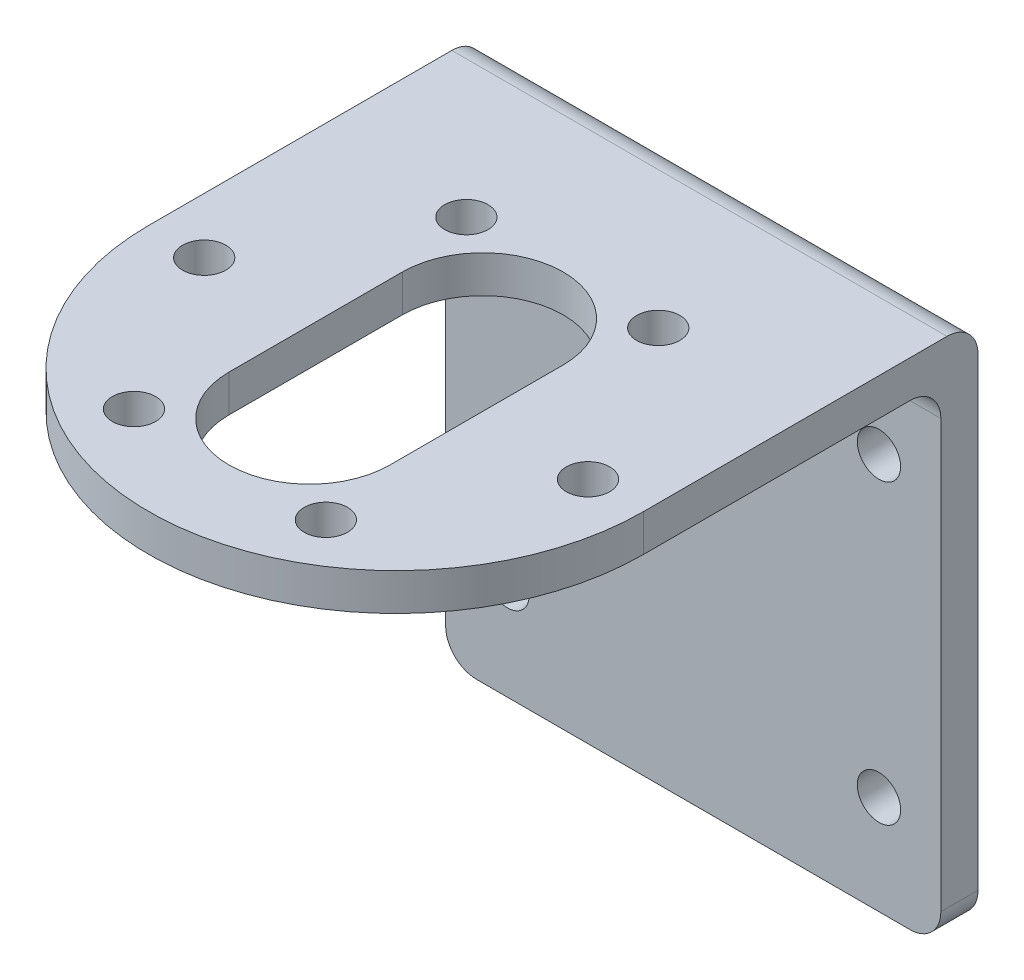
ISO-10303-21;
HEADER;
FILE_DESCRIPTION(('STEP AP214'),'2;1');
FILE_NAME('part.step','',(''),(''),'','','');
FILE_SCHEMA(('AUTOMOTIVE_DESIGN { 1 0 10303 214 1 1 1 1 }'));
ENDSEC;
DATA;
#1=APPLICATION_CONTEXT('core data for automotive mechanical design processes');
#2=APPLICATION_PROTOCOL_DEFINITION('international standard','automotive_design',2000,#1);
#3=PRODUCT_CONTEXT('',#1,'mechanical');
#4=PRODUCT('Part','Part','',(#3));
#5=PRODUCT_RELATED_PRODUCT_CATEGORY('part','',(#4));
#6=PRODUCT_DEFINITION_FORMATION('','',#4);
#7=PRODUCT_DEFINITION_CONTEXT('part definition',#1,'design');
#8=PRODUCT_DEFINITION('design','',#6,#7);
#9=PRODUCT_DEFINITION_SHAPE('','',#8);
#10=(LENGTH_UNIT() NAMED_UNIT(*) SI_UNIT(.MILLI.,.METRE.));
#11=(NAMED_UNIT(*) PLANE_ANGLE_UNIT() SI_UNIT($,.RADIAN.));
#12=(NAMED_UNIT(*) SI_UNIT($,.STERADIAN.) SOLID_ANGLE_UNIT());
#13=UNCERTAINTY_MEASURE_WITH_UNIT(LENGTH_MEASURE(1.E-05),#10,'distance_accuracy_value','');
#14=(GEOMETRIC_REPRESENTATION_CONTEXT(3) GLOBAL_UNCERTAINTY_ASSIGNED_CONTEXT((#13)) GLOBAL_UNIT_ASSIGNED_CONTEXT((#10,
#11,#12)) REPRESENTATION_CONTEXT('',''));
#15=CARTESIAN_POINT('',(0.,0.,0.));
#16=DIRECTION('',(0.,0.,1.));
#17=DIRECTION('',(1.,0.,0.));
#18=AXIS2_PLACEMENT_3D('',#15,#16,#17);
#19=CARTESIAN_POINT('',(20.,19.75,0.));
#20=DIRECTION('',(0.,0.,1.));
#21=DIRECTION('',(1.,0.,0.));
#22=AXIS2_PLACEMENT_3D('',#19,#20,#21);
#23=PLANE('',#22);
#24=CARTESIAN_POINT('',(35.,8.,0.));
#25=DIRECTION('',(0.,0.,-1.));
#26=DIRECTION('',(1.,0.,0.));
#27=AXIS2_PLACEMENT_3D('',#24,#25,#26);
#28=CIRCLE('',#27,1.75);
#29=CARTESIAN_POINT('',(33.25,8.,0.));
#30=VERTEX_POINT('',#29);
#31=EDGE_CURVE('E67',#30,#30,#28,.T.);
#32=ORIENTED_EDGE('',*,*,#31,.F.);
#33=EDGE_LOOP('',(#32));
#34=FACE_BOUND('',#33,.T.);
#35=CARTESIAN_POINT('',(35.,32.,0.));
#36=DIRECTION('',(0.,0.,-1.));
#37=DIRECTION('',(1.,0.,0.));
#38=AXIS2_PLACEMENT_3D('',#35,#36,#37);
#39=CIRCLE('',#38,1.75);
#40=CARTESIAN_POINT('',(33.25,32.,0.));
#41=VERTEX_POINT('',#40);
#42=EDGE_CURVE('E82',#41,#41,#39,.T.);
#43=ORIENTED_EDGE('',*,*,#42,.F.);
#44=EDGE_LOOP('',(#43));
#45=FACE_BOUND('',#44,.T.);
#46=CARTESIAN_POINT('',(5.,8.,0.));
#47=DIRECTION('',(0.,0.,-1.));
#48=DIRECTION('',(1.,0.,0.));
#49=AXIS2_PLACEMENT_3D('',#46,#47,#48);
#50=CIRCLE('',#49,1.75);
#51=CARTESIAN_POINT('',(3.25,8.,0.));
#52=VERTEX_POINT('',#51);
#53=EDGE_CURVE('E50',#52,#52,#50,.T.);
#54=ORIENTED_EDGE('',*,*,#53,.F.);
#55=EDGE_LOOP('',(#54));
#56=FACE_BOUND('',#55,.T.);
#57=CARTESIAN_POINT('',(5.,32.,0.));
#58=DIRECTION('',(0.,0.,-1.));
#59=DIRECTION('',(1.,0.,0.));
#60=AXIS2_PLACEMENT_3D('',#57,#58,#59);
#61=CIRCLE('',#60,1.75);
#62=CARTESIAN_POINT('',(3.25,32.,0.));
#63=VERTEX_POINT('',#62);
#64=EDGE_CURVE('E26',#63,#63,#61,.T.);
#65=ORIENTED_EDGE('',*,*,#64,.F.);
#66=EDGE_LOOP('',(#65));
#67=FACE_BOUND('',#66,.T.);
#68=CARTESIAN_POINT('',(37.5,2.5,0.));
#69=DIRECTION('',(0.,0.,1.));
#70=DIRECTION('',(0.707106781186548,-0.707106781186548,0.));
#71=AXIS2_PLACEMENT_3D('',#68,#69,#70);
#72=CIRCLE('',#71,2.5);
#73=CARTESIAN_POINT('',(37.5,0.,0.));
#74=VERTEX_POINT('',#73);
#75=CARTESIAN_POINT('',(40.,2.5,0.));
#76=VERTEX_POINT('',#75);
#77=EDGE_CURVE('E186',#74,#76,#72,.T.);
#78=ORIENTED_EDGE('',*,*,#77,.F.);
#79=DIRECTION('',(1.,0.,0.));
#80=VECTOR('',#79,1.);
#81=CARTESIAN_POINT('',(0.,0.,0.));
#82=LINE('',#81,#80);
#83=CARTESIAN_POINT('',(2.5,0.,0.));
#84=VERTEX_POINT('',#83);
#85=EDGE_CURVE('E211',#84,#74,#82,.T.);
#86=ORIENTED_EDGE('',*,*,#85,.F.);
#87=CARTESIAN_POINT('',(2.5,2.5,0.));
#88=DIRECTION('',(0.,0.,1.));
#89=DIRECTION('',(-0.707106781186548,-0.707106781186548,0.));
#90=AXIS2_PLACEMENT_3D('',#87,#88,#89);
#91=CIRCLE('',#90,2.5);
#92=CARTESIAN_POINT('',(0.,2.5,0.));
#93=VERTEX_POINT('',#92);
#94=EDGE_CURVE('E247',#93,#84,#91,.T.);
#95=ORIENTED_EDGE('',*,*,#94,.F.);
#96=DIRECTION('',(0.,-1.,0.));
#97=VECTOR('',#96,1.);
#98=CARTESIAN_POINT('',(0.,42.5,0.));
#99=LINE('',#98,#97);
#100=CARTESIAN_POINT('',(0.,40.,0.));
#101=VERTEX_POINT('',#100);
#102=EDGE_CURVE('E256',#101,#93,#99,.T.);
#103=ORIENTED_EDGE('',*,*,#102,.F.);
#104=DIRECTION('',(-1.,0.,0.));
#105=VECTOR('',#104,1.);
#106=CARTESIAN_POINT('',(30.,40.,0.));
#107=LINE('',#106,#105);
#108=CARTESIAN_POINT('',(40.,40.,0.));
#109=VERTEX_POINT('',#108);
#110=EDGE_CURVE('E215',#109,#101,#107,.T.);
#111=ORIENTED_EDGE('',*,*,#110,.F.);
#112=DIRECTION('',(0.,1.,0.));
#113=VECTOR('',#112,1.);
#114=CARTESIAN_POINT('',(40.,0.,0.));
#115=LINE('',#114,#113);
#116=EDGE_CURVE('E11',#76,#109,#115,.T.);
#117=ORIENTED_EDGE('',*,*,#116,.F.);
#118=EDGE_LOOP('',(#78,#86,#95,#103,#111,#117));
#119=FACE_BOUND('',#118,.T.);
#120=ADVANCED_FACE('F17',(#34,#45,#56,#67,#119),#23,.F.);
#121=CARTESIAN_POINT('',(40.,0.,0.));
#122=DIRECTION('',(1.,0.,0.));
#123=DIRECTION('',(0.,1.,0.));
#124=AXIS2_PLACEMENT_3D('',#121,#122,#123);
#125=PLANE('',#124);
#126=DIRECTION('',(0.,0.,1.));
#127=VECTOR('',#126,1.);
#128=CARTESIAN_POINT('',(40.,2.5,0.));
#129=LINE('',#128,#127);
#130=CARTESIAN_POINT('',(40.,2.5,3.));
#131=VERTEX_POINT('',#130);
#132=EDGE_CURVE('E190',#76,#131,#129,.T.);
#133=ORIENTED_EDGE('',*,*,#132,.F.);
#134=ORIENTED_EDGE('',*,*,#116,.T.);
#135=CARTESIAN_POINT('',(40.,40.,2.5));
#136=DIRECTION('',(-1.,0.,0.));
#137=DIRECTION('',(0.,0.707106781186548,-0.707106781186548));
#138=AXIS2_PLACEMENT_3D('',#135,#136,#137);
#139=CIRCLE('',#138,2.5);
#140=CARTESIAN_POINT('',(40.,42.5,2.5));
#141=VERTEX_POINT('',#140);
#142=EDGE_CURVE('E264',#141,#109,#139,.T.);
#143=ORIENTED_EDGE('',*,*,#142,.F.);
#144=DIRECTION('',(0.,0.,1.));
#145=VECTOR('',#144,1.);
#146=CARTESIAN_POINT('',(40.,42.5,0.));
#147=LINE('',#146,#145);
#148=CARTESIAN_POINT('',(40.,42.5,27.));
#149=VERTEX_POINT('',#148);
#150=EDGE_CURVE('E184',#141,#149,#147,.T.);
#151=ORIENTED_EDGE('',*,*,#150,.T.);
#152=DIRECTION('',(0.,-1.,0.));
#153=VECTOR('',#152,1.);
#154=CARTESIAN_POINT('',(40.,39.5,27.));
#155=LINE('',#154,#153);
#156=CARTESIAN_POINT('',(40.,39.5,27.));
#157=VERTEX_POINT('',#156);
#158=EDGE_CURVE('E102',#149,#157,#155,.T.);
#159=ORIENTED_EDGE('',*,*,#158,.T.);
#160=DIRECTION('',(0.,0.,1.));
#161=VECTOR('',#160,1.);
#162=CARTESIAN_POINT('',(40.,39.5,0.));
#163=LINE('',#162,#161);
#164=CARTESIAN_POINT('',(40.,39.5,5.5));
#165=VERTEX_POINT('',#164);
#166=EDGE_CURVE('E451',#165,#157,#163,.T.);
#167=ORIENTED_EDGE('',*,*,#166,.F.);
#168=CARTESIAN_POINT('',(40.,37.,5.5));
#169=DIRECTION('',(1.,0.,0.));
#170=DIRECTION('',(0.,0.707106781186548,-0.707106781186548));
#171=AXIS2_PLACEMENT_3D('',#168,#169,#170);
#172=CIRCLE('',#171,2.5);
#173=CARTESIAN_POINT('',(40.,37.,3.));
#174=VERTEX_POINT('',#173);
#175=EDGE_CURVE('E839',#174,#165,#172,.T.);
#176=ORIENTED_EDGE('',*,*,#175,.F.);
#177=DIRECTION('',(0.,1.,0.));
#178=VECTOR('',#177,1.);
#179=CARTESIAN_POINT('',(40.,0.,3.));
#180=LINE('',#179,#178);
#181=EDGE_CURVE('E224',#131,#174,#180,.T.);
#182=ORIENTED_EDGE('',*,*,#181,.F.);
#183=EDGE_LOOP('',(#133,#134,#143,#151,#159,#167,#176,#182));
#184=FACE_BOUND('',#183,.T.);
#185=ADVANCED_FACE('F613',(#184),#125,.T.);
#186=CARTESIAN_POINT('',(5.,32.,0.));
#187=DIRECTION('',(0.,0.,1.));
#188=DIRECTION('',(1.,0.,0.));
#189=AXIS2_PLACEMENT_3D('',#186,#187,#188);
#190=CYLINDRICAL_SURFACE('',#189,1.75);
#191=CARTESIAN_POINT('',(5.,32.,3.));
#192=DIRECTION('',(0.,0.,-1.));
#193=DIRECTION('',(1.,0.,0.));
#194=AXIS2_PLACEMENT_3D('',#191,#192,#193);
#195=CIRCLE('',#194,1.75);
#196=CARTESIAN_POINT('',(3.25,32.,3.));
#197=VERTEX_POINT('',#196);
#198=EDGE_CURVE('E228',#197,#197,#195,.T.);
#199=ORIENTED_EDGE('',*,*,#198,.F.);
#200=DIRECTION('',(0.,0.,-1.));
#201=VECTOR('',#200,1.);
#202=CARTESIAN_POINT('',(3.25,32.,0.));
#203=LINE('',#202,#201);
#204=EDGE_CURVE('E20',#197,#63,#203,.T.);
#205=ORIENTED_EDGE('',*,*,#204,.T.);
#206=ORIENTED_EDGE('',*,*,#64,.T.);
#207=ORIENTED_EDGE('',*,*,#204,.F.);
#208=EDGE_LOOP('',(#199,#205,#206,#207));
#209=FACE_BOUND('',#208,.T.);
#210=ADVANCED_FACE('F618',(#209),#190,.F.);
#211=CARTESIAN_POINT('',(5.,8.,0.));
#212=DIRECTION('',(0.,0.,1.));
#213=DIRECTION('',(1.,0.,0.));
#214=AXIS2_PLACEMENT_3D('',#211,#212,#213);
#215=CYLINDRICAL_SURFACE('',#214,1.75);
#216=CARTESIAN_POINT('',(5.,8.,3.));
#217=DIRECTION('',(0.,0.,-1.));
#218=DIRECTION('',(1.,0.,0.));
#219=AXIS2_PLACEMENT_3D('',#216,#217,#218);
#220=CIRCLE('',#219,1.75);
#221=CARTESIAN_POINT('',(3.25,8.,3.));
#222=VERTEX_POINT('',#221);
#223=EDGE_CURVE('E232',#222,#222,#220,.T.);
#224=ORIENTED_EDGE('',*,*,#223,.F.);
#225=DIRECTION('',(0.,0.,-1.));
#226=VECTOR('',#225,1.);
#227=CARTESIAN_POINT('',(3.25,8.,0.));
#228=LINE('',#227,#226);
#229=EDGE_CURVE('E119',#222,#52,#228,.T.);
#230=ORIENTED_EDGE('',*,*,#229,.T.);
#231=ORIENTED_EDGE('',*,*,#53,.T.);
#232=ORIENTED_EDGE('',*,*,#229,.F.);
#233=EDGE_LOOP('',(#224,#230,#231,#232));
#234=FACE_BOUND('',#233,.T.);
#235=ADVANCED_FACE('F623',(#234),#215,.F.);
#236=CARTESIAN_POINT('',(35.,32.,0.));
#237=DIRECTION('',(0.,0.,1.));
#238=DIRECTION('',(1.,0.,0.));
#239=AXIS2_PLACEMENT_3D('',#236,#237,#238);
#240=CYLINDRICAL_SURFACE('',#239,1.75);
#241=CARTESIAN_POINT('',(35.,32.,3.));
#242=DIRECTION('',(0.,0.,-1.));
#243=DIRECTION('',(1.,0.,0.));
#244=AXIS2_PLACEMENT_3D('',#241,#242,#243);
#245=CIRCLE('',#244,1.75);
#246=CARTESIAN_POINT('',(33.25,32.,3.));
#247=VERTEX_POINT('',#246);
#248=EDGE_CURVE('E175',#247,#247,#245,.T.);
#249=ORIENTED_EDGE('',*,*,#248,.F.);
#250=DIRECTION('',(0.,0.,-1.));
#251=VECTOR('',#250,1.);
#252=CARTESIAN_POINT('',(33.25,32.,0.));
#253=LINE('',#252,#251);
#254=EDGE_CURVE('E75',#247,#41,#253,.T.);
#255=ORIENTED_EDGE('',*,*,#254,.T.);
#256=ORIENTED_EDGE('',*,*,#42,.T.);
#257=ORIENTED_EDGE('',*,*,#254,.F.);
#258=EDGE_LOOP('',(#249,#255,#256,#257));
#259=FACE_BOUND('',#258,.T.);
#260=ADVANCED_FACE('F561',(#259),#240,.F.);
#261=CARTESIAN_POINT('',(35.,8.,0.));
#262=DIRECTION('',(0.,0.,1.));
#263=DIRECTION('',(1.,0.,0.));
#264=AXIS2_PLACEMENT_3D('',#261,#262,#263);
#265=CYLINDRICAL_SURFACE('',#264,1.75);
#266=CARTESIAN_POINT('',(35.,8.,3.));
#267=DIRECTION('',(0.,0.,-1.));
#268=DIRECTION('',(1.,0.,0.));
#269=AXIS2_PLACEMENT_3D('',#266,#267,#268);
#270=CIRCLE('',#269,1.75);
#271=CARTESIAN_POINT('',(33.25,8.,3.));
#272=VERTEX_POINT('',#271);
#273=EDGE_CURVE('E171',#272,#272,#270,.T.);
#274=ORIENTED_EDGE('',*,*,#273,.F.);
#275=DIRECTION('',(0.,0.,-1.));
#276=VECTOR('',#275,1.);
#277=CARTESIAN_POINT('',(33.25,8.,0.));
#278=LINE('',#277,#276);
#279=EDGE_CURVE('E71',#272,#30,#278,.T.);
#280=ORIENTED_EDGE('',*,*,#279,.T.);
#281=ORIENTED_EDGE('',*,*,#31,.T.);
#282=ORIENTED_EDGE('',*,*,#279,.F.);
#283=EDGE_LOOP('',(#274,#280,#281,#282));
#284=FACE_BOUND('',#283,.T.);
#285=ADVANCED_FACE('F69',(#284),#265,.F.);
#286=CARTESIAN_POINT('',(35.5,39.5,26.9999999467333));
#287=DIRECTION('',(0.,1.,0.));
#288=DIRECTION('',(1.,0.,0.));
#289=AXIS2_PLACEMENT_3D('',#286,#287,#288);
#290=CYLINDRICAL_SURFACE('',#289,1.75);
#291=CARTESIAN_POINT('',(35.5,39.5,26.9999999467333));
#292=DIRECTION('',(0.,1.,0.));
#293=DIRECTION('',(1.,0.,0.));
#294=AXIS2_PLACEMENT_3D('',#291,#292,#293);
#295=CIRCLE('',#294,1.75);
#296=CARTESIAN_POINT('',(33.75,39.5,26.9999999467333));
#297=VERTEX_POINT('',#296);
#298=EDGE_CURVE('E166',#297,#297,#295,.T.);
#299=ORIENTED_EDGE('',*,*,#298,.F.);
#300=DIRECTION('',(0.,1.,0.));
#301=VECTOR('',#300,1.);
#302=CARTESIAN_POINT('',(33.75,39.5,26.9999999467333));
#303=LINE('',#302,#301);
#304=CARTESIAN_POINT('',(33.75,42.5,26.9999999467333));
#305=VERTEX_POINT('',#304);
#306=EDGE_CURVE('E85',#297,#305,#303,.T.);
#307=ORIENTED_EDGE('',*,*,#306,.T.);
#308=CARTESIAN_POINT('',(35.5,42.5,26.9999999467333));
#309=DIRECTION('',(0.,-1.,0.));
#310=DIRECTION('',(1.,0.,0.));
#311=AXIS2_PLACEMENT_3D('',#308,#309,#310);
#312=CIRCLE('',#311,1.75);
#313=EDGE_CURVE('E148',#305,#305,#312,.T.);
#314=ORIENTED_EDGE('',*,*,#313,.F.);
#315=ORIENTED_EDGE('',*,*,#306,.F.);
#316=EDGE_LOOP('',(#299,#307,#314,#315));
#317=FACE_BOUND('',#316,.T.);
#318=ADVANCED_FACE('F644',(#317),#290,.F.);
#319=CARTESIAN_POINT('',(12.2500000461303,39.5,40.4233937852921));
#320=DIRECTION('',(0.,1.,0.));
#321=DIRECTION('',(1.,0.,0.));
#322=AXIS2_PLACEMENT_3D('',#319,#320,#321);
#323=CYLINDRICAL_SURFACE('',#322,1.75);
#324=CARTESIAN_POINT('',(12.2500000461303,39.5,40.4233937852921));
#325=DIRECTION('',(0.,1.,0.));
#326=DIRECTION('',(1.,0.,0.));
#327=AXIS2_PLACEMENT_3D('',#324,#325,#326);
#328=CIRCLE('',#327,1.75);
#329=CARTESIAN_POINT('',(10.5000000461303,39.5,40.4233937852921));
#330=VERTEX_POINT('',#329);
#331=EDGE_CURVE('E164',#330,#330,#328,.T.);
#332=ORIENTED_EDGE('',*,*,#331,.F.);
#333=DIRECTION('',(0.,1.,0.));
#334=VECTOR('',#333,1.);
#335=CARTESIAN_POINT('',(10.5000000461303,39.5,40.4233937852921));
#336=LINE('',#335,#334);
#337=CARTESIAN_POINT('',(10.5000000461303,42.5,40.4233937852921));
#338=VERTEX_POINT('',#337);
#339=EDGE_CURVE('E111',#330,#338,#336,.T.);
#340=ORIENTED_EDGE('',*,*,#339,.T.);
#341=CARTESIAN_POINT('',(12.2500000461303,42.5,40.4233937852921));
#342=DIRECTION('',(0.,-1.,0.));
#343=DIRECTION('',(1.,0.,0.));
#344=AXIS2_PLACEMENT_3D('',#341,#342,#343);
#345=CIRCLE('',#344,1.75);
#346=EDGE_CURVE('E143',#338,#338,#345,.T.);
#347=ORIENTED_EDGE('',*,*,#346,.F.);
#348=ORIENTED_EDGE('',*,*,#339,.F.);
#349=EDGE_LOOP('',(#332,#340,#347,#348));
#350=FACE_BOUND('',#349,.T.);
#351=ADVANCED_FACE('F652',(#350),#323,.F.);
#352=CARTESIAN_POINT('',(27.7500000461303,39.5,40.4233937320255));
#353=DIRECTION('',(0.,1.,0.));
#354=DIRECTION('',(1.,0.,0.));
#355=AXIS2_PLACEMENT_3D('',#352,#353,#354);
#356=CYLINDRICAL_SURFACE('',#355,1.75);
#357=CARTESIAN_POINT('',(27.7500000461303,39.5,40.4233937320255));
#358=DIRECTION('',(0.,1.,0.));
#359=DIRECTION('',(1.,0.,0.));
#360=AXIS2_PLACEMENT_3D('',#357,#358,#359);
#361=CIRCLE('',#360,1.75);
#362=CARTESIAN_POINT('',(26.0000000461303,39.5,40.4233937320255));
#363=VERTEX_POINT('',#362);
#364=EDGE_CURVE('E141',#363,#363,#361,.T.);
#365=ORIENTED_EDGE('',*,*,#364,.F.);
#366=DIRECTION('',(0.,1.,0.));
#367=VECTOR('',#366,1.);
#368=CARTESIAN_POINT('',(26.0000000461303,39.5,40.4233937320255));
#369=LINE('',#368,#367);
#370=CARTESIAN_POINT('',(26.0000000461303,42.5,40.4233937320255));
#371=VERTEX_POINT('',#370);
#372=EDGE_CURVE('E110',#363,#371,#369,.T.);
#373=ORIENTED_EDGE('',*,*,#372,.T.);
#374=CARTESIAN_POINT('',(27.7500000461303,42.5,40.4233937320255));
#375=DIRECTION('',(0.,-1.,0.));
#376=DIRECTION('',(1.,0.,0.));
#377=AXIS2_PLACEMENT_3D('',#374,#375,#376);
#378=CIRCLE('',#377,1.75);
#379=EDGE_CURVE('E147',#371,#371,#378,.T.);
#380=ORIENTED_EDGE('',*,*,#379,.F.);
#381=ORIENTED_EDGE('',*,*,#372,.F.);
#382=EDGE_LOOP('',(#365,#373,#380,#381));
#383=FACE_BOUND('',#382,.T.);
#384=ADVANCED_FACE('F657',(#383),#356,.F.);
#385=CARTESIAN_POINT('',(27.7499999538697,39.5,13.5766062147079));
#386=DIRECTION('',(0.,1.,0.));
#387=DIRECTION('',(1.,0.,0.));
#388=AXIS2_PLACEMENT_3D('',#385,#386,#387);
#389=CYLINDRICAL_SURFACE('',#388,1.75);
#390=CARTESIAN_POINT('',(27.7499999538697,39.5,13.5766062147079));
#391=DIRECTION('',(0.,1.,0.));
#392=DIRECTION('',(1.,0.,0.));
#393=AXIS2_PLACEMENT_3D('',#390,#391,#392);
#394=CIRCLE('',#393,1.75);
#395=CARTESIAN_POINT('',(25.9999999538697,39.5,13.5766062147079));
#396=VERTEX_POINT('',#395);
#397=EDGE_CURVE('E137',#396,#396,#394,.T.);
#398=ORIENTED_EDGE('',*,*,#397,.F.);
#399=DIRECTION('',(0.,1.,0.));
#400=VECTOR('',#399,1.);
#401=CARTESIAN_POINT('',(25.9999999538697,39.5,13.5766062147079));
#402=LINE('',#401,#400);
#403=CARTESIAN_POINT('',(25.9999999538697,42.5,13.5766062147079));
#404=VERTEX_POINT('',#403);
#405=EDGE_CURVE('E106',#396,#404,#402,.T.);
#406=ORIENTED_EDGE('',*,*,#405,.T.);
#407=CARTESIAN_POINT('',(27.7499999538697,42.5,13.5766062147079));
#408=DIRECTION('',(0.,-1.,0.));
#409=DIRECTION('',(1.,0.,0.));
#410=AXIS2_PLACEMENT_3D('',#407,#408,#409);
#411=CIRCLE('',#410,1.75);
#412=EDGE_CURVE('E194',#404,#404,#411,.T.);
#413=ORIENTED_EDGE('',*,*,#412,.F.);
#414=ORIENTED_EDGE('',*,*,#405,.F.);
#415=EDGE_LOOP('',(#398,#406,#413,#414));
#416=FACE_BOUND('',#415,.T.);
#417=ADVANCED_FACE('F662',(#416),#389,.F.);
#418=CARTESIAN_POINT('',(20.,39.5,27.));
#419=DIRECTION('',(0.,1.,0.));
#420=DIRECTION('',(1.,0.,0.));
#421=AXIS2_PLACEMENT_3D('',#418,#419,#420);
#422=CYLINDRICAL_SURFACE('',#421,20.);
#423=CARTESIAN_POINT('',(20.,39.5,27.));
#424=DIRECTION('',(0.,-1.,0.));
#425=DIRECTION('',(1.,0.,0.));
#426=AXIS2_PLACEMENT_3D('',#423,#424,#425);
#427=CIRCLE('',#426,20.);
#428=CARTESIAN_POINT('',(0.,39.5,27.));
#429=VERTEX_POINT('',#428);
#430=EDGE_CURVE('E131',#157,#429,#427,.T.);
#431=ORIENTED_EDGE('',*,*,#430,.F.);
#432=ORIENTED_EDGE('',*,*,#158,.F.);
#433=CARTESIAN_POINT('',(20.,42.5,27.));
#434=DIRECTION('',(0.,1.,0.));
#435=DIRECTION('',(1.,0.,0.));
#436=AXIS2_PLACEMENT_3D('',#433,#434,#435);
#437=CIRCLE('',#436,20.);
#438=CARTESIAN_POINT('',(0.,42.5,27.));
#439=VERTEX_POINT('',#438);
#440=EDGE_CURVE('E180',#439,#149,#437,.T.);
#441=ORIENTED_EDGE('',*,*,#440,.F.);
#442=DIRECTION('',(0.,-1.,0.));
#443=VECTOR('',#442,1.);
#444=CARTESIAN_POINT('',(0.,39.5,27.));
#445=LINE('',#444,#443);
#446=EDGE_CURVE('E260',#439,#429,#445,.T.);
#447=ORIENTED_EDGE('',*,*,#446,.T.);
#448=EDGE_LOOP('',(#431,#432,#441,#447));
#449=FACE_BOUND('',#448,.T.);
#450=ADVANCED_FACE('F475',(#449),#422,.T.);
#451=CARTESIAN_POINT('',(4.5,39.5,27.0000000532667));
#452=DIRECTION('',(0.,1.,0.));
#453=DIRECTION('',(1.,0.,0.));
#454=AXIS2_PLACEMENT_3D('',#451,#452,#453);
#455=CYLINDRICAL_SURFACE('',#454,1.75);
#456=CARTESIAN_POINT('',(4.5,39.5,27.0000000532667));
#457=DIRECTION('',(0.,1.,0.));
#458=DIRECTION('',(1.,0.,0.));
#459=AXIS2_PLACEMENT_3D('',#456,#457,#458);
#460=CIRCLE('',#459,1.75);
#461=CARTESIAN_POINT('',(2.75,39.5,27.0000000532667));
#462=VERTEX_POINT('',#461);
#463=EDGE_CURVE('E142',#462,#462,#460,.T.);
#464=ORIENTED_EDGE('',*,*,#463,.F.);
#465=DIRECTION('',(0.,1.,0.));
#466=VECTOR('',#465,1.);
#467=CARTESIAN_POINT('',(2.75,39.5,27.0000000532667));
#468=LINE('',#467,#466);
#469=CARTESIAN_POINT('',(2.75,42.5,27.0000000532667));
#470=VERTEX_POINT('',#469);
#471=EDGE_CURVE('E98',#462,#470,#468,.T.);
#472=ORIENTED_EDGE('',*,*,#471,.T.);
#473=CARTESIAN_POINT('',(4.5,42.5,27.0000000532667));
#474=DIRECTION('',(0.,-1.,0.));
#475=DIRECTION('',(1.,0.,0.));
#476=AXIS2_PLACEMENT_3D('',#473,#474,#475);
#477=CIRCLE('',#476,1.75);
#478=EDGE_CURVE('E277',#470,#470,#477,.T.);
#479=ORIENTED_EDGE('',*,*,#478,.F.);
#480=ORIENTED_EDGE('',*,*,#471,.F.);
#481=EDGE_LOOP('',(#464,#472,#479,#480));
#482=FACE_BOUND('',#481,.T.);
#483=ADVANCED_FACE('F679',(#482),#455,.F.);
#484=CARTESIAN_POINT('',(19.999999929592,39.5,34.));
#485=DIRECTION('',(0.,1.,0.));
#486=DIRECTION('',(1.,0.,1.00582837785186E-08));
#487=AXIS2_PLACEMENT_3D('',#484,#485,#486);
#488=CYLINDRICAL_SURFACE('',#487,6.5);
#489=CARTESIAN_POINT('',(19.999999929592,39.5,34.));
#490=DIRECTION('',(0.,1.,0.));
#491=DIRECTION('',(1.,0.,1.00582837785186E-08));
#492=AXIS2_PLACEMENT_3D('',#489,#490,#491);
#493=CIRCLE('',#492,6.5);
#494=CARTESIAN_POINT('',(13.499999929592,39.5,34.0000005316912));
#495=VERTEX_POINT('',#494);
#496=CARTESIAN_POINT('',(26.499999929592,39.5,34.0000000653788));
#497=VERTEX_POINT('',#496);
#498=EDGE_CURVE('E154',#495,#497,#493,.T.);
#499=ORIENTED_EDGE('',*,*,#498,.F.);
#500=DIRECTION('',(0.,1.,0.));
#501=VECTOR('',#500,1.);
#502=CARTESIAN_POINT('',(13.499999929592,39.5,34.0000005316912));
#503=LINE('',#502,#501);
#504=CARTESIAN_POINT('',(13.499999929592,42.5,34.0000005316912));
#505=VERTEX_POINT('',#504);
#506=EDGE_CURVE('E89',#495,#505,#503,.T.);
#507=ORIENTED_EDGE('',*,*,#506,.T.);
#508=CARTESIAN_POINT('',(19.999999929592,42.5,34.));
#509=DIRECTION('',(0.,-1.,0.));
#510=DIRECTION('',(1.,0.,1.00582837785186E-08));
#511=AXIS2_PLACEMENT_3D('',#508,#509,#510);
#512=CIRCLE('',#511,6.5);
#513=CARTESIAN_POINT('',(26.499999929592,42.5,34.0000000653788));
#514=VERTEX_POINT('',#513);
#515=EDGE_CURVE('E293',#514,#505,#512,.T.);
#516=ORIENTED_EDGE('',*,*,#515,.F.);
#517=DIRECTION('',(0.,1.,0.));
#518=VECTOR('',#517,1.);
#519=CARTESIAN_POINT('',(26.499999929592,39.5,34.0000000653788));
#520=LINE('',#519,#518);
#521=EDGE_CURVE('E94',#497,#514,#520,.T.);
#522=ORIENTED_EDGE('',*,*,#521,.F.);
#523=EDGE_LOOP('',(#499,#507,#516,#522));
#524=FACE_BOUND('',#523,.T.);
#525=ADVANCED_FACE('F407',(#524),#488,.F.);
#526=CARTESIAN_POINT('',(26.499999929592,39.5,34.0000000653788));
#527=DIRECTION('',(1.,0.,1.00582830953044E-08));
#528=DIRECTION('',(0.,-1.,0.));
#529=AXIS2_PLACEMENT_3D('',#526,#527,#528);
#530=PLANE('',#529);
#531=DIRECTION('',(1.00582830953044E-08,0.,-1.));
#532=VECTOR('',#531,1.);
#533=CARTESIAN_POINT('',(26.5000001005828,39.5,17.0000001659617));
#534=LINE('',#533,#532);
#535=CARTESIAN_POINT('',(26.500000070408,39.5,20.0000000175339));
#536=VERTEX_POINT('',#535);
#537=EDGE_CURVE('E149',#497,#536,#534,.T.);
#538=ORIENTED_EDGE('',*,*,#537,.F.);
#539=ORIENTED_EDGE('',*,*,#521,.T.);
#540=DIRECTION('',(-1.00582830953044E-08,0.,1.));
#541=VECTOR('',#540,1.);
#542=CARTESIAN_POINT('',(26.5000001005828,42.5,16.999999964796));
#543=LINE('',#542,#541);
#544=CARTESIAN_POINT('',(26.500000070408,42.5,20.0000000175339));
#545=VERTEX_POINT('',#544);
#546=EDGE_CURVE('E289',#545,#514,#543,.T.);
#547=ORIENTED_EDGE('',*,*,#546,.F.);
#548=DIRECTION('',(0.,1.,0.));
#549=VECTOR('',#548,1.);
#550=CARTESIAN_POINT('',(26.500000070408,39.5,20.0000000175339));
#551=LINE('',#550,#549);
#552=EDGE_CURVE('E91',#536,#545,#551,.T.);
#553=ORIENTED_EDGE('',*,*,#552,.F.);
#554=EDGE_LOOP('',(#538,#539,#547,#553));
#555=FACE_BOUND('',#554,.T.);
#556=ADVANCED_FACE('F402',(#555),#530,.F.);
#557=CARTESIAN_POINT('',(20.000000070408,39.5,20.));
#558=DIRECTION('',(0.,1.,0.));
#559=DIRECTION('',(-1.,0.,-1.75986794368135E-08));
#560=AXIS2_PLACEMENT_3D('',#557,#558,#559);
#561=CYLINDRICAL_SURFACE('',#560,6.5);
#562=CARTESIAN_POINT('',(20.000000070408,39.5,20.));
#563=DIRECTION('',(0.,1.,0.));
#564=DIRECTION('',(-1.,0.,-1.75986794368135E-08));
#565=AXIS2_PLACEMENT_3D('',#562,#563,#564);
#566=CIRCLE('',#565,6.5);
#567=CARTESIAN_POINT('',(13.500000070408,39.5,19.9999998856086));
#568=VERTEX_POINT('',#567);
#569=EDGE_CURVE('E153',#536,#568,#566,.T.);
#570=ORIENTED_EDGE('',*,*,#569,.F.);
#571=ORIENTED_EDGE('',*,*,#552,.T.);
#572=CARTESIAN_POINT('',(20.000000070408,42.5,20.));
#573=DIRECTION('',(0.,-1.,0.));
#574=DIRECTION('',(-1.,0.,-1.75986794368135E-08));
#575=AXIS2_PLACEMENT_3D('',#572,#573,#574);
#576=CIRCLE('',#575,6.5);
#577=CARTESIAN_POINT('',(13.500000070408,42.5,19.9999998856086));
#578=VERTEX_POINT('',#577);
#579=EDGE_CURVE('E285',#578,#545,#576,.T.);
#580=ORIENTED_EDGE('',*,*,#579,.F.);
#581=DIRECTION('',(0.,1.,0.));
#582=VECTOR('',#581,1.);
#583=CARTESIAN_POINT('',(13.500000070408,39.5,19.9999998856086));
#584=LINE('',#583,#582);
#585=EDGE_CURVE('E239',#568,#578,#584,.T.);
#586=ORIENTED_EDGE('',*,*,#585,.F.);
#587=EDGE_LOOP('',(#570,#571,#580,#586));
#588=FACE_BOUND('',#587,.T.);
#589=ADVANCED_FACE('F412',(#588),#561,.F.);
#590=CARTESIAN_POINT('',(13.500000070408,39.5,19.9999998856086));
#591=DIRECTION('',(-1.,0.,-1.75986794954283E-08));
#592=DIRECTION('',(-1.75986794954283E-08,0.,1.));
#593=AXIS2_PLACEMENT_3D('',#590,#591,#592);
#594=PLANE('',#593);
#595=DIRECTION('',(-1.75986794954283E-08,0.,1.));
#596=VECTOR('',#595,1.);
#597=CARTESIAN_POINT('',(13.5000002463948,39.5,10.0000000615954));
#598=LINE('',#597,#596);
#599=EDGE_CURVE('E155',#568,#495,#598,.T.);
#600=ORIENTED_EDGE('',*,*,#599,.F.);
#601=ORIENTED_EDGE('',*,*,#585,.T.);
#602=DIRECTION('',(1.75986794954283E-08,0.,-1.));
#603=VECTOR('',#602,1.);
#604=CARTESIAN_POINT('',(13.5000002463948,42.5,9.99999970962179));
#605=LINE('',#604,#603);
#606=EDGE_CURVE('E281',#505,#578,#605,.T.);
#607=ORIENTED_EDGE('',*,*,#606,.F.);
#608=ORIENTED_EDGE('',*,*,#506,.F.);
#609=EDGE_LOOP('',(#600,#601,#607,#608));
#610=FACE_BOUND('',#609,.T.);
#611=ADVANCED_FACE('F426',(#610),#594,.F.);
#612=CARTESIAN_POINT('',(12.2499999538697,39.5,13.5766062679745));
#613=DIRECTION('',(0.,1.,0.));
#614=DIRECTION('',(1.,0.,0.));
#615=AXIS2_PLACEMENT_3D('',#612,#613,#614);
#616=CYLINDRICAL_SURFACE('',#615,1.75);
#617=CARTESIAN_POINT('',(12.2499999538697,39.5,13.5766062679745));
#618=DIRECTION('',(0.,1.,0.));
#619=DIRECTION('',(1.,0.,0.));
#620=AXIS2_PLACEMENT_3D('',#617,#618,#619);
#621=CIRCLE('',#620,1.75);
#622=CARTESIAN_POINT('',(10.4999999538697,39.5,13.5766062679745));
#623=VERTEX_POINT('',#622);
#624=EDGE_CURVE('E136',#623,#623,#621,.T.);
#625=ORIENTED_EDGE('',*,*,#624,.F.);
#626=DIRECTION('',(0.,1.,0.));
#627=VECTOR('',#626,1.);
#628=CARTESIAN_POINT('',(10.4999999538697,39.5,13.5766062679745));
#629=LINE('',#628,#627);
#630=CARTESIAN_POINT('',(10.4999999538697,42.5,13.5766062679745));
#631=VERTEX_POINT('',#630);
#632=EDGE_CURVE('E243',#623,#631,#629,.T.);
#633=ORIENTED_EDGE('',*,*,#632,.T.);
#634=CARTESIAN_POINT('',(12.2499999538697,42.5,13.5766062679745));
#635=DIRECTION('',(0.,-1.,0.));
#636=DIRECTION('',(1.,0.,0.));
#637=AXIS2_PLACEMENT_3D('',#634,#635,#636);
#638=CIRCLE('',#637,1.75);
#639=EDGE_CURVE('E294',#631,#631,#638,.T.);
#640=ORIENTED_EDGE('',*,*,#639,.F.);
#641=ORIENTED_EDGE('',*,*,#632,.F.);
#642=EDGE_LOOP('',(#625,#633,#640,#641));
#643=FACE_BOUND('',#642,.T.);
#644=ADVANCED_FACE('F306',(#643),#616,.F.);
#645=CARTESIAN_POINT('',(0.,39.5,0.));
#646=DIRECTION('',(-1.,0.,0.));
#647=DIRECTION('',(0.,1.,0.));
#648=AXIS2_PLACEMENT_3D('',#645,#646,#647);
#649=PLANE('',#648);
#650=DIRECTION('',(0.,0.,-1.));
#651=VECTOR('',#650,1.);
#652=CARTESIAN_POINT('',(0.,2.5,0.));
#653=LINE('',#652,#651);
#654=CARTESIAN_POINT('',(0.,2.5,3.));
#655=VERTEX_POINT('',#654);
#656=EDGE_CURVE('E174',#655,#93,#653,.T.);
#657=ORIENTED_EDGE('',*,*,#656,.F.);
#658=DIRECTION('',(0.,-1.,0.));
#659=VECTOR('',#658,1.);
#660=CARTESIAN_POINT('',(0.,42.5,3.));
#661=LINE('',#660,#659);
#662=CARTESIAN_POINT('',(0.,37.,3.));
#663=VERTEX_POINT('',#662);
#664=EDGE_CURVE('E219',#663,#655,#661,.T.);
#665=ORIENTED_EDGE('',*,*,#664,.F.);
#666=CARTESIAN_POINT('',(0.,37.,5.5));
#667=DIRECTION('',(-1.,0.,0.));
#668=DIRECTION('',(0.,0.707106781186548,-0.707106781186548));
#669=AXIS2_PLACEMENT_3D('',#666,#667,#668);
#670=CIRCLE('',#669,2.5);
#671=CARTESIAN_POINT('',(0.,39.5,5.5));
#672=VERTEX_POINT('',#671);
#673=EDGE_CURVE('E440',#672,#663,#670,.T.);
#674=ORIENTED_EDGE('',*,*,#673,.F.);
#675=DIRECTION('',(0.,0.,1.));
#676=VECTOR('',#675,1.);
#677=CARTESIAN_POINT('',(0.,39.5,0.));
#678=LINE('',#677,#676);
#679=EDGE_CURVE('E133',#672,#429,#678,.T.);
#680=ORIENTED_EDGE('',*,*,#679,.T.);
#681=ORIENTED_EDGE('',*,*,#446,.F.);
#682=DIRECTION('',(0.,0.,1.));
#683=VECTOR('',#682,1.);
#684=CARTESIAN_POINT('',(0.,42.5,0.));
#685=LINE('',#684,#683);
#686=CARTESIAN_POINT('',(0.,42.5,2.5));
#687=VERTEX_POINT('',#686);
#688=EDGE_CURVE('E185',#687,#439,#685,.T.);
#689=ORIENTED_EDGE('',*,*,#688,.F.);
#690=CARTESIAN_POINT('',(0.,40.,2.5));
#691=DIRECTION('',(1.,0.,0.));
#692=DIRECTION('',(0.,0.707106781186548,-0.707106781186548));
#693=AXIS2_PLACEMENT_3D('',#690,#691,#692);
#694=CIRCLE('',#693,2.5);
#695=EDGE_CURVE('E251',#101,#687,#694,.T.);
#696=ORIENTED_EDGE('',*,*,#695,.F.);
#697=ORIENTED_EDGE('',*,*,#102,.T.);
#698=EDGE_LOOP('',(#657,#665,#674,#680,#681,#689,#696,#697));
#699=FACE_BOUND('',#698,.T.);
#700=ADVANCED_FACE('F314',(#699),#649,.T.);
#701=CARTESIAN_POINT('',(40.,42.5,0.));
#702=DIRECTION('',(0.,1.,0.));
#703=DIRECTION('',(1.,0.,0.));
#704=AXIS2_PLACEMENT_3D('',#701,#702,#703);
#705=PLANE('',#704);
#706=ORIENTED_EDGE('',*,*,#639,.T.);
#707=EDGE_LOOP('',(#706));
#708=FACE_BOUND('',#707,.T.);
#709=ORIENTED_EDGE('',*,*,#606,.T.);
#710=ORIENTED_EDGE('',*,*,#579,.T.);
#711=ORIENTED_EDGE('',*,*,#546,.T.);
#712=ORIENTED_EDGE('',*,*,#515,.T.);
#713=EDGE_LOOP('',(#709,#710,#711,#712));
#714=FACE_BOUND('',#713,.T.);
#715=ORIENTED_EDGE('',*,*,#478,.T.);
#716=EDGE_LOOP('',(#715));
#717=FACE_BOUND('',#716,.T.);
#718=ORIENTED_EDGE('',*,*,#412,.T.);
#719=EDGE_LOOP('',(#718));
#720=FACE_BOUND('',#719,.T.);
#721=ORIENTED_EDGE('',*,*,#379,.T.);
#722=EDGE_LOOP('',(#721));
#723=FACE_BOUND('',#722,.T.);
#724=ORIENTED_EDGE('',*,*,#346,.T.);
#725=EDGE_LOOP('',(#724));
#726=FACE_BOUND('',#725,.T.);
#727=ORIENTED_EDGE('',*,*,#313,.T.);
#728=EDGE_LOOP('',(#727));
#729=FACE_BOUND('',#728,.T.);
#730=DIRECTION('',(1.,0.,0.));
#731=VECTOR('',#730,1.);
#732=CARTESIAN_POINT('',(30.,42.5,2.5));
#733=LINE('',#732,#731);
#734=EDGE_CURVE('E255',#687,#141,#733,.T.);
#735=ORIENTED_EDGE('',*,*,#734,.F.);
#736=ORIENTED_EDGE('',*,*,#688,.T.);
#737=ORIENTED_EDGE('',*,*,#440,.T.);
#738=ORIENTED_EDGE('',*,*,#150,.F.);
#739=EDGE_LOOP('',(#735,#736,#737,#738));
#740=FACE_BOUND('',#739,.T.);
#741=ADVANCED_FACE('F310',(#708,#714,#717,#720,#723,#726,#729,#740),#705,.T.);
#742=CARTESIAN_POINT('',(30.,40.,2.5));
#743=DIRECTION('',(-1.,0.,0.));
#744=DIRECTION('',(0.,0.707106781186548,-0.707106781186548));
#745=AXIS2_PLACEMENT_3D('',#742,#743,#744);
#746=CYLINDRICAL_SURFACE('',#745,2.5);
#747=ORIENTED_EDGE('',*,*,#695,.T.);
#748=ORIENTED_EDGE('',*,*,#734,.T.);
#749=ORIENTED_EDGE('',*,*,#142,.T.);
#750=ORIENTED_EDGE('',*,*,#110,.T.);
#751=EDGE_LOOP('',(#747,#748,#749,#750));
#752=FACE_BOUND('',#751,.T.);
#753=ADVANCED_FACE('F313',(#752),#746,.T.);
#754=CARTESIAN_POINT('',(2.5,2.5,0.));
#755=DIRECTION('',(0.,0.,1.));
#756=DIRECTION('',(-0.707106781186548,-0.707106781186548,0.));
#757=AXIS2_PLACEMENT_3D('',#754,#755,#756);
#758=CYLINDRICAL_SURFACE('',#757,2.5);
#759=CARTESIAN_POINT('',(2.5,2.5,3.));
#760=DIRECTION('',(0.,0.,-1.));
#761=DIRECTION('',(-0.707106781186548,-0.707106781186548,0.));
#762=AXIS2_PLACEMENT_3D('',#759,#760,#761);
#763=CIRCLE('',#762,2.5);
#764=CARTESIAN_POINT('',(2.5,0.,3.));
#765=VERTEX_POINT('',#764);
#766=EDGE_CURVE('E220',#765,#655,#763,.T.);
#767=ORIENTED_EDGE('',*,*,#766,.T.);
#768=ORIENTED_EDGE('',*,*,#656,.T.);
#769=ORIENTED_EDGE('',*,*,#94,.T.);
#770=DIRECTION('',(0.,0.,1.));
#771=VECTOR('',#770,1.);
#772=CARTESIAN_POINT('',(2.5,0.,0.));
#773=LINE('',#772,#771);
#774=EDGE_CURVE('E207',#84,#765,#773,.T.);
#775=ORIENTED_EDGE('',*,*,#774,.T.);
#776=EDGE_LOOP('',(#767,#768,#769,#775));
#777=FACE_BOUND('',#776,.T.);
#778=ADVANCED_FACE('F568',(#777),#758,.T.);
#779=CARTESIAN_POINT('',(20.,19.75,3.));
#780=DIRECTION('',(0.,0.,1.));
#781=DIRECTION('',(1.,0.,0.));
#782=AXIS2_PLACEMENT_3D('',#779,#780,#781);
#783=PLANE('',#782);
#784=ORIENTED_EDGE('',*,*,#273,.T.);
#785=EDGE_LOOP('',(#784));
#786=FACE_BOUND('',#785,.T.);
#787=ORIENTED_EDGE('',*,*,#248,.T.);
#788=EDGE_LOOP('',(#787));
#789=FACE_BOUND('',#788,.T.);
#790=ORIENTED_EDGE('',*,*,#223,.T.);
#791=EDGE_LOOP('',(#790));
#792=FACE_BOUND('',#791,.T.);
#793=ORIENTED_EDGE('',*,*,#198,.T.);
#794=EDGE_LOOP('',(#793));
#795=FACE_BOUND('',#794,.T.);
#796=DIRECTION('',(1.,0.,0.));
#797=VECTOR('',#796,1.);
#798=CARTESIAN_POINT('',(10.,37.,3.));
#799=LINE('',#798,#797);
#800=EDGE_CURVE('E443',#663,#174,#799,.T.);
#801=ORIENTED_EDGE('',*,*,#800,.F.);
#802=ORIENTED_EDGE('',*,*,#664,.T.);
#803=ORIENTED_EDGE('',*,*,#766,.F.);
#804=DIRECTION('',(1.,0.,0.));
#805=VECTOR('',#804,1.);
#806=CARTESIAN_POINT('',(0.,0.,3.));
#807=LINE('',#806,#805);
#808=CARTESIAN_POINT('',(37.5,0.,3.));
#809=VERTEX_POINT('',#808);
#810=EDGE_CURVE('E198',#765,#809,#807,.T.);
#811=ORIENTED_EDGE('',*,*,#810,.T.);
#812=CARTESIAN_POINT('',(37.5,2.5,3.));
#813=DIRECTION('',(0.,0.,-1.));
#814=DIRECTION('',(0.707106781186548,-0.707106781186548,0.));
#815=AXIS2_PLACEMENT_3D('',#812,#813,#814);
#816=CIRCLE('',#815,2.5);
#817=EDGE_CURVE('E170',#131,#809,#816,.T.);
#818=ORIENTED_EDGE('',*,*,#817,.F.);
#819=ORIENTED_EDGE('',*,*,#181,.T.);
#820=EDGE_LOOP('',(#801,#802,#803,#811,#818,#819));
#821=FACE_BOUND('',#820,.T.);
#822=ADVANCED_FACE('F564',(#786,#789,#792,#795,#821),#783,.T.);
#823=CARTESIAN_POINT('',(0.,0.,0.));
#824=DIRECTION('',(0.,-1.,0.));
#825=DIRECTION('',(0.,0.,-1.));
#826=AXIS2_PLACEMENT_3D('',#823,#824,#825);
#827=PLANE('',#826);
#828=DIRECTION('',(0.,0.,-1.));
#829=VECTOR('',#828,1.);
#830=CARTESIAN_POINT('',(37.5,0.,0.));
#831=LINE('',#830,#829);
#832=EDGE_CURVE('E179',#809,#74,#831,.T.);
#833=ORIENTED_EDGE('',*,*,#832,.F.);
#834=ORIENTED_EDGE('',*,*,#810,.F.);
#835=ORIENTED_EDGE('',*,*,#774,.F.);
#836=ORIENTED_EDGE('',*,*,#85,.T.);
#837=EDGE_LOOP('',(#833,#834,#835,#836));
#838=FACE_BOUND('',#837,.T.);
#839=ADVANCED_FACE('F567',(#838),#827,.T.);
#840=CARTESIAN_POINT('',(37.5,2.5,0.));
#841=DIRECTION('',(0.,0.,1.));
#842=DIRECTION('',(0.707106781186548,-0.707106781186548,0.));
#843=AXIS2_PLACEMENT_3D('',#840,#841,#842);
#844=CYLINDRICAL_SURFACE('',#843,2.5);
#845=ORIENTED_EDGE('',*,*,#817,.T.);
#846=ORIENTED_EDGE('',*,*,#832,.T.);
#847=ORIENTED_EDGE('',*,*,#77,.T.);
#848=ORIENTED_EDGE('',*,*,#132,.T.);
#849=EDGE_LOOP('',(#845,#846,#847,#848));
#850=FACE_BOUND('',#849,.T.);
#851=ADVANCED_FACE('F747',(#850),#844,.T.);
#852=CARTESIAN_POINT('',(0.,39.5,0.));
#853=DIRECTION('',(0.,-1.,0.));
#854=DIRECTION('',(0.,0.,-1.));
#855=AXIS2_PLACEMENT_3D('',#852,#853,#854);
#856=PLANE('',#855);
#857=ORIENTED_EDGE('',*,*,#298,.T.);
#858=EDGE_LOOP('',(#857));
#859=FACE_BOUND('',#858,.T.);
#860=ORIENTED_EDGE('',*,*,#331,.T.);
#861=EDGE_LOOP('',(#860));
#862=FACE_BOUND('',#861,.T.);
#863=ORIENTED_EDGE('',*,*,#364,.T.);
#864=EDGE_LOOP('',(#863));
#865=FACE_BOUND('',#864,.T.);
#866=ORIENTED_EDGE('',*,*,#397,.T.);
#867=EDGE_LOOP('',(#866));
#868=FACE_BOUND('',#867,.T.);
#869=ORIENTED_EDGE('',*,*,#463,.T.);
#870=EDGE_LOOP('',(#869));
#871=FACE_BOUND('',#870,.T.);
#872=ORIENTED_EDGE('',*,*,#599,.T.);
#873=ORIENTED_EDGE('',*,*,#498,.T.);
#874=ORIENTED_EDGE('',*,*,#537,.T.);
#875=ORIENTED_EDGE('',*,*,#569,.T.);
#876=EDGE_LOOP('',(#872,#873,#874,#875));
#877=FACE_BOUND('',#876,.T.);
#878=ORIENTED_EDGE('',*,*,#624,.T.);
#879=EDGE_LOOP('',(#878));
#880=FACE_BOUND('',#879,.T.);
#881=DIRECTION('',(-1.,0.,0.));
#882=VECTOR('',#881,1.);
#883=CARTESIAN_POINT('',(10.,39.5,5.5));
#884=LINE('',#883,#882);
#885=EDGE_CURVE('E436',#165,#672,#884,.T.);
#886=ORIENTED_EDGE('',*,*,#885,.F.);
#887=ORIENTED_EDGE('',*,*,#166,.T.);
#888=ORIENTED_EDGE('',*,*,#430,.T.);
#889=ORIENTED_EDGE('',*,*,#679,.F.);
#890=EDGE_LOOP('',(#886,#887,#888,#889));
#891=FACE_BOUND('',#890,.T.);
#892=ADVANCED_FACE('F422',(#859,#862,#865,#868,#871,#877,#880,#891),#856,.T.);
#893=CARTESIAN_POINT('',(10.,37.,5.5));
#894=DIRECTION('',(-1.,0.,0.));
#895=DIRECTION('',(0.,0.707106781186548,-0.707106781186548));
#896=AXIS2_PLACEMENT_3D('',#893,#894,#895);
#897=CYLINDRICAL_SURFACE('',#896,2.5);
#898=ORIENTED_EDGE('',*,*,#175,.T.);
#899=ORIENTED_EDGE('',*,*,#885,.T.);
#900=ORIENTED_EDGE('',*,*,#673,.T.);
#901=ORIENTED_EDGE('',*,*,#800,.T.);
#902=EDGE_LOOP('',(#898,#899,#900,#901));
#903=FACE_BOUND('',#902,.T.);
#904=ADVANCED_FACE('F581',(#903),#897,.F.);
#905=CLOSED_SHELL('',(#120,#185,#210,#235,#260,#285,#318,#351,#384,#417,#450,#483,#525,#556,
#589,#611,#644,#700,#741,#753,#778,#822,#839,#851,#892,#904));
#906=MANIFOLD_SOLID_BREP('B1',#905);
#907=ADVANCED_BREP_SHAPE_REPRESENTATION('',(#18,#906),#14);
#908=SHAPE_DEFINITION_REPRESENTATION(#9,#907);
ENDSEC;
END-ISO-10303-21;
